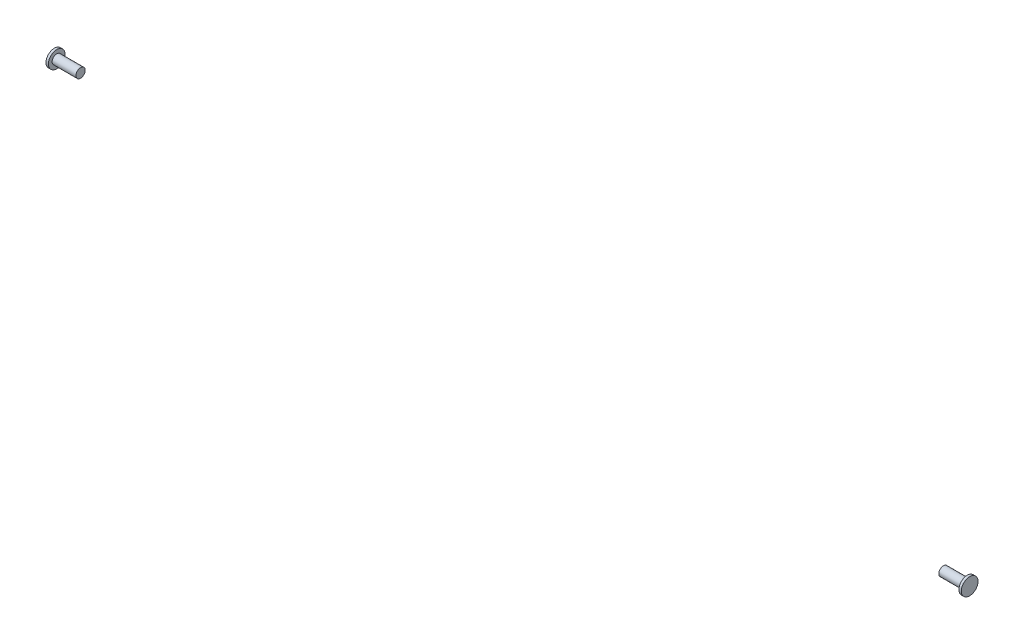
ISO-10303-21;
HEADER;
FILE_DESCRIPTION(('STEP AP214'),'2;1');
FILE_NAME('part.step','',(''),(''),'','','');
FILE_SCHEMA(('AUTOMOTIVE_DESIGN { 1 0 10303 214 1 1 1 1 }'));
ENDSEC;
DATA;
#1=APPLICATION_CONTEXT('core data for automotive mechanical design processes');
#2=APPLICATION_PROTOCOL_DEFINITION('international standard','automotive_design',2000,#1);
#3=PRODUCT_CONTEXT('',#1,'mechanical');
#4=PRODUCT('Part','Part','',(#3));
#5=PRODUCT_RELATED_PRODUCT_CATEGORY('part','',(#4));
#6=PRODUCT_DEFINITION_FORMATION('','',#4);
#7=PRODUCT_DEFINITION_CONTEXT('part definition',#1,'design');
#8=PRODUCT_DEFINITION('design','',#6,#7);
#9=PRODUCT_DEFINITION_SHAPE('','',#8);
#10=(LENGTH_UNIT() NAMED_UNIT(*) SI_UNIT(.MILLI.,.METRE.));
#11=(NAMED_UNIT(*) PLANE_ANGLE_UNIT() SI_UNIT($,.RADIAN.));
#12=(NAMED_UNIT(*) SI_UNIT($,.STERADIAN.) SOLID_ANGLE_UNIT());
#13=UNCERTAINTY_MEASURE_WITH_UNIT(LENGTH_MEASURE(1.E-05),#10,'distance_accuracy_value','');
#14=(GEOMETRIC_REPRESENTATION_CONTEXT(3) GLOBAL_UNCERTAINTY_ASSIGNED_CONTEXT((#13)) GLOBAL_UNIT_ASSIGNED_CONTEXT((#10,
#11,#12)) REPRESENTATION_CONTEXT('',''));
#15=CARTESIAN_POINT('',(0.,0.,0.));
#16=DIRECTION('',(0.,0.,1.));
#17=DIRECTION('',(1.,0.,0.));
#18=AXIS2_PLACEMENT_3D('',#15,#16,#17);
#19=CARTESIAN_POINT('',(-271.2,-116.785581206254,67.993998047111));
#20=DIRECTION('',(1.,0.,0.));
#21=DIRECTION('',(0.,0.,-1.));
#22=AXIS2_PLACEMENT_3D('',#19,#20,#21);
#23=PLANE('',#22);
#24=CARTESIAN_POINT('',(-271.2,-116.785581206254,67.993998047111));
#25=DIRECTION('',(-1.,0.,0.));
#26=DIRECTION('',(0.,0.,1.));
#27=AXIS2_PLACEMENT_3D('',#24,#25,#26);
#28=CIRCLE('',#27,2.9);
#29=CARTESIAN_POINT('',(-271.2,-116.785581206254,70.893998047111));
#30=VERTEX_POINT('',#29);
#31=EDGE_CURVE('P0_E23',#30,#30,#28,.T.);
#32=ORIENTED_EDGE('',*,*,#31,.F.);
#33=EDGE_LOOP('',(#32));
#34=FACE_BOUND('',#33,.T.);
#35=ADVANCED_FACE('P0_F15',(#34),#23,.T.);
#36=CARTESIAN_POINT('',(-271.2,-116.785581206254,67.993998047111));
#37=DIRECTION('',(-1.,0.,0.));
#38=DIRECTION('',(0.,0.,1.));
#39=AXIS2_PLACEMENT_3D('',#36,#37,#38);
#40=CYLINDRICAL_SURFACE('',#39,2.9);
#41=CARTESIAN_POINT('',(-286.2,-116.785581206254,67.993998047111));
#42=DIRECTION('',(1.,0.,0.));
#43=DIRECTION('',(0.,0.,-1.));
#44=AXIS2_PLACEMENT_3D('',#41,#42,#43);
#45=CIRCLE('',#44,2.9);
#46=CARTESIAN_POINT('',(-286.2,-116.785581206254,65.093998047111));
#47=VERTEX_POINT('',#46);
#48=EDGE_CURVE('P0_E10',#47,#47,#45,.F.);
#49=ORIENTED_EDGE('',*,*,#48,.F.);
#50=EDGE_LOOP('',(#49));
#51=FACE_BOUND('',#50,.T.);
#52=ORIENTED_EDGE('',*,*,#31,.T.);
#53=EDGE_LOOP('',(#52));
#54=FACE_BOUND('',#53,.T.);
#55=ADVANCED_FACE('P0_F17',(#51,#54),#40,.T.);
#56=CARTESIAN_POINT('',(-287.7,-116.785581206254,67.993998047111));
#57=DIRECTION('',(-1.,0.,0.));
#58=DIRECTION('',(0.,0.,1.));
#59=AXIS2_PLACEMENT_3D('',#56,#57,#58);
#60=PLANE('',#59);
#61=CARTESIAN_POINT('',(-287.7,-116.785581206254,67.993998047111));
#62=DIRECTION('',(1.,0.,0.));
#63=DIRECTION('',(0.,0.,-1.));
#64=AXIS2_PLACEMENT_3D('',#61,#62,#63);
#65=CIRCLE('',#64,5.25);
#66=CARTESIAN_POINT('',(-287.7,-116.785581206254,62.743998047111));
#67=VERTEX_POINT('',#66);
#68=EDGE_CURVE('P0_E30',#67,#67,#65,.T.);
#69=ORIENTED_EDGE('',*,*,#68,.F.);
#70=EDGE_LOOP('',(#69));
#71=FACE_BOUND('',#70,.T.);
#72=ADVANCED_FACE('P0_F45',(#71),#60,.T.);
#73=CARTESIAN_POINT('',(-286.2,-116.785581206254,67.993998047111));
#74=DIRECTION('',(1.,0.,0.));
#75=DIRECTION('',(0.,0.,-1.));
#76=AXIS2_PLACEMENT_3D('',#73,#74,#75);
#77=PLANE('',#76);
#78=ORIENTED_EDGE('',*,*,#48,.T.);
#79=EDGE_LOOP('',(#78));
#80=FACE_BOUND('',#79,.T.);
#81=CARTESIAN_POINT('',(-286.2,-116.785581206254,67.993998047111));
#82=DIRECTION('',(-1.,0.,0.));
#83=DIRECTION('',(0.,0.,1.));
#84=AXIS2_PLACEMENT_3D('',#81,#82,#83);
#85=CIRCLE('',#84,5.25);
#86=CARTESIAN_POINT('',(-286.2,-116.785581206254,73.243998047111));
#87=VERTEX_POINT('',#86);
#88=EDGE_CURVE('P0_E34',#87,#87,#85,.T.);
#89=ORIENTED_EDGE('',*,*,#88,.F.);
#90=EDGE_LOOP('',(#89));
#91=FACE_BOUND('',#90,.T.);
#92=ADVANCED_FACE('P0_F43',(#80,#91),#77,.T.);
#93=CARTESIAN_POINT('',(-286.2,-116.785581206254,67.993998047111));
#94=DIRECTION('',(-1.,0.,0.));
#95=DIRECTION('',(0.,0.,1.));
#96=AXIS2_PLACEMENT_3D('',#93,#94,#95);
#97=CYLINDRICAL_SURFACE('',#96,5.25);
#98=ORIENTED_EDGE('',*,*,#68,.T.);
#99=EDGE_LOOP('',(#98));
#100=FACE_BOUND('',#99,.T.);
#101=ORIENTED_EDGE('',*,*,#88,.T.);
#102=EDGE_LOOP('',(#101));
#103=FACE_BOUND('',#102,.T.);
#104=ADVANCED_FACE('P0_F41',(#100,#103),#97,.T.);
#105=CLOSED_SHELL('',(#35,#55,#72,#92,#104));
#106=MANIFOLD_SOLID_BREP('P0_B1',#105);
#107=CARTESIAN_POINT('',(271.2,-116.785581206254,67.993998047111));
#108=DIRECTION('',(-1.,0.,0.));
#109=DIRECTION('',(0.,0.,1.));
#110=AXIS2_PLACEMENT_3D('',#107,#108,#109);
#111=PLANE('',#110);
#112=CARTESIAN_POINT('',(271.2,-116.785581206254,67.993998047111));
#113=DIRECTION('',(1.,0.,0.));
#114=DIRECTION('',(0.,0.,-1.));
#115=AXIS2_PLACEMENT_3D('',#112,#113,#114);
#116=CIRCLE('',#115,2.9);
#117=CARTESIAN_POINT('',(271.2,-116.785581206254,65.093998047111));
#118=VERTEX_POINT('',#117);
#119=EDGE_CURVE('P1_E23',#118,#118,#116,.T.);
#120=ORIENTED_EDGE('',*,*,#119,.F.);
#121=EDGE_LOOP('',(#120));
#122=FACE_BOUND('',#121,.T.);
#123=ADVANCED_FACE('P1_F15',(#122),#111,.T.);
#124=CARTESIAN_POINT('',(271.2,-116.785581206254,67.993998047111));
#125=DIRECTION('',(1.,0.,0.));
#126=DIRECTION('',(0.,0.,-1.));
#127=AXIS2_PLACEMENT_3D('',#124,#125,#126);
#128=CYLINDRICAL_SURFACE('',#127,2.9);
#129=CARTESIAN_POINT('',(286.2,-116.785581206254,67.993998047111));
#130=DIRECTION('',(-1.,0.,0.));
#131=DIRECTION('',(0.,0.,1.));
#132=AXIS2_PLACEMENT_3D('',#129,#130,#131);
#133=CIRCLE('',#132,2.9);
#134=CARTESIAN_POINT('',(286.2,-116.785581206254,70.893998047111));
#135=VERTEX_POINT('',#134);
#136=EDGE_CURVE('P1_E10',#135,#135,#133,.F.);
#137=ORIENTED_EDGE('',*,*,#136,.F.);
#138=EDGE_LOOP('',(#137));
#139=FACE_BOUND('',#138,.T.);
#140=ORIENTED_EDGE('',*,*,#119,.T.);
#141=EDGE_LOOP('',(#140));
#142=FACE_BOUND('',#141,.T.);
#143=ADVANCED_FACE('P1_F17',(#139,#142),#128,.T.);
#144=CARTESIAN_POINT('',(287.7,-116.785581206254,67.993998047111));
#145=DIRECTION('',(1.,0.,0.));
#146=DIRECTION('',(0.,0.,-1.));
#147=AXIS2_PLACEMENT_3D('',#144,#145,#146);
#148=PLANE('',#147);
#149=CARTESIAN_POINT('',(287.7,-116.785581206254,67.993998047111));
#150=DIRECTION('',(-1.,0.,0.));
#151=DIRECTION('',(0.,0.,1.));
#152=AXIS2_PLACEMENT_3D('',#149,#150,#151);
#153=CIRCLE('',#152,5.25);
#154=CARTESIAN_POINT('',(287.7,-116.785581206254,73.243998047111));
#155=VERTEX_POINT('',#154);
#156=EDGE_CURVE('P1_E29',#155,#155,#153,.T.);
#157=ORIENTED_EDGE('',*,*,#156,.F.);
#158=EDGE_LOOP('',(#157));
#159=FACE_BOUND('',#158,.T.);
#160=ADVANCED_FACE('P1_F45',(#159),#148,.T.);
#161=CARTESIAN_POINT('',(286.2,-116.785581206254,67.993998047111));
#162=DIRECTION('',(-1.,0.,0.));
#163=DIRECTION('',(0.,0.,1.));
#164=AXIS2_PLACEMENT_3D('',#161,#162,#163);
#165=PLANE('',#164);
#166=ORIENTED_EDGE('',*,*,#136,.T.);
#167=EDGE_LOOP('',(#166));
#168=FACE_BOUND('',#167,.T.);
#169=CARTESIAN_POINT('',(286.2,-116.785581206254,67.993998047111));
#170=DIRECTION('',(1.,0.,0.));
#171=DIRECTION('',(0.,0.,-1.));
#172=AXIS2_PLACEMENT_3D('',#169,#170,#171);
#173=CIRCLE('',#172,5.25);
#174=CARTESIAN_POINT('',(286.2,-116.785581206254,62.743998047111));
#175=VERTEX_POINT('',#174);
#176=EDGE_CURVE('P1_E34',#175,#175,#173,.T.);
#177=ORIENTED_EDGE('',*,*,#176,.F.);
#178=EDGE_LOOP('',(#177));
#179=FACE_BOUND('',#178,.T.);
#180=ADVANCED_FACE('P1_F43',(#168,#179),#165,.T.);
#181=CARTESIAN_POINT('',(286.2,-116.785581206254,67.993998047111));
#182=DIRECTION('',(1.,0.,0.));
#183=DIRECTION('',(0.,0.,-1.));
#184=AXIS2_PLACEMENT_3D('',#181,#182,#183);
#185=CYLINDRICAL_SURFACE('',#184,5.25);
#186=ORIENTED_EDGE('',*,*,#156,.T.);
#187=EDGE_LOOP('',(#186));
#188=FACE_BOUND('',#187,.T.);
#189=ORIENTED_EDGE('',*,*,#176,.T.);
#190=EDGE_LOOP('',(#189));
#191=FACE_BOUND('',#190,.T.);
#192=ADVANCED_FACE('P1_F41',(#188,#191),#185,.T.);
#193=CLOSED_SHELL('',(#123,#143,#160,#180,#192));
#194=MANIFOLD_SOLID_BREP('P1_B1',#193);
#195=ADVANCED_BREP_SHAPE_REPRESENTATION('',(#18,#106,#194),#14);
#196=SHAPE_DEFINITION_REPRESENTATION(#9,#195);
ENDSEC;
END-ISO-10303-21;
